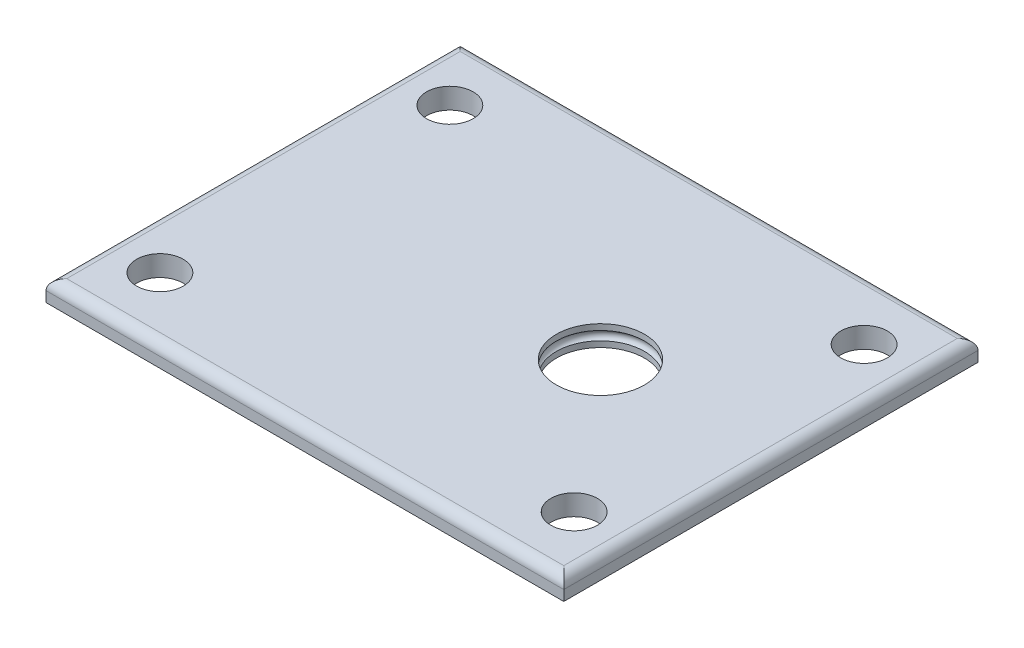
ISO-10303-21;
HEADER;
FILE_DESCRIPTION(('STEP AP214'),'2;1');
FILE_NAME('part.step','',(''),(''),'','','');
FILE_SCHEMA(('AUTOMOTIVE_DESIGN { 1 0 10303 214 1 1 1 1 }'));
ENDSEC;
DATA;
#1=APPLICATION_CONTEXT('core data for automotive mechanical design processes');
#2=APPLICATION_PROTOCOL_DEFINITION('international standard','automotive_design',2000,#1);
#3=PRODUCT_CONTEXT('',#1,'mechanical');
#4=PRODUCT('Part','Part','',(#3));
#5=PRODUCT_RELATED_PRODUCT_CATEGORY('part','',(#4));
#6=PRODUCT_DEFINITION_FORMATION('','',#4);
#7=PRODUCT_DEFINITION_CONTEXT('part definition',#1,'design');
#8=PRODUCT_DEFINITION('design','',#6,#7);
#9=PRODUCT_DEFINITION_SHAPE('','',#8);
#10=(LENGTH_UNIT() NAMED_UNIT(*) SI_UNIT(.MILLI.,.METRE.));
#11=(NAMED_UNIT(*) PLANE_ANGLE_UNIT() SI_UNIT($,.RADIAN.));
#12=(NAMED_UNIT(*) SI_UNIT($,.STERADIAN.) SOLID_ANGLE_UNIT());
#13=UNCERTAINTY_MEASURE_WITH_UNIT(LENGTH_MEASURE(1.E-05),#10,'distance_accuracy_value','');
#14=(GEOMETRIC_REPRESENTATION_CONTEXT(3) GLOBAL_UNCERTAINTY_ASSIGNED_CONTEXT((#13)) GLOBAL_UNIT_ASSIGNED_CONTEXT((#10,
#11,#12)) REPRESENTATION_CONTEXT('',''));
#15=CARTESIAN_POINT('',(0.,0.,0.));
#16=DIRECTION('',(0.,0.,1.));
#17=DIRECTION('',(1.,0.,0.));
#18=AXIS2_PLACEMENT_3D('',#15,#16,#17);
#19=CARTESIAN_POINT('',(28.54,-0.00100000000000013,14.));
#20=DIRECTION('',(0.,1.,0.));
#21=DIRECTION('',(0.,0.,1.));
#22=AXIS2_PLACEMENT_3D('',#19,#20,#21);
#23=CYLINDRICAL_SURFACE('',#22,4.25000000000001);
#24=CARTESIAN_POINT('',(28.54,2.,14.));
#25=DIRECTION('',(0.,1.,0.));
#26=DIRECTION('',(0.,0.,1.));
#27=AXIS2_PLACEMENT_3D('',#24,#25,#26);
#28=CIRCLE('',#27,4.25000000000001);
#29=CARTESIAN_POINT('',(28.54,2.,18.25));
#30=VERTEX_POINT('',#29);
#31=EDGE_CURVE('E149',#30,#30,#28,.T.);
#32=ORIENTED_EDGE('',*,*,#31,.T.);
#33=EDGE_LOOP('',(#32));
#34=FACE_BOUND('',#33,.T.);
#35=CARTESIAN_POINT('',(28.54,1.43301270189221,14.));
#36=DIRECTION('',(0.,-1.,0.));
#37=DIRECTION('',(0.,0.,-1.));
#38=AXIS2_PLACEMENT_3D('',#35,#36,#37);
#39=CIRCLE('',#38,4.25000000000001);
#40=CARTESIAN_POINT('',(28.54,1.43301270189221,9.74999999999999));
#41=VERTEX_POINT('',#40);
#42=EDGE_CURVE('E145',#41,#41,#39,.F.);
#43=ORIENTED_EDGE('',*,*,#42,.F.);
#44=EDGE_LOOP('',(#43));
#45=FACE_BOUND('',#44,.T.);
#46=ADVANCED_FACE('F38',(#34,#45),#23,.F.);
#47=CARTESIAN_POINT('',(28.54,0.,14.));
#48=DIRECTION('',(0.,1.,0.));
#49=DIRECTION('',(0.,0.,1.));
#50=AXIS2_PLACEMENT_3D('',#47,#48,#49);
#51=CIRCLE('',#50,4.25000000000001);
#52=CARTESIAN_POINT('',(28.54,0.,18.25));
#53=VERTEX_POINT('',#52);
#54=EDGE_CURVE('E246',#53,#53,#51,.F.);
#55=ORIENTED_EDGE('',*,*,#54,.T.);
#56=EDGE_LOOP('',(#55));
#57=FACE_BOUND('',#56,.T.);
#58=CARTESIAN_POINT('',(28.54,0.566987298107786,14.));
#59=DIRECTION('',(0.,1.,0.));
#60=DIRECTION('',(0.,0.,1.));
#61=AXIS2_PLACEMENT_3D('',#58,#59,#60);
#62=CIRCLE('',#61,4.25000000000001);
#63=CARTESIAN_POINT('',(28.54,0.566987298107786,18.25));
#64=VERTEX_POINT('',#63);
#65=EDGE_CURVE('E141',#64,#64,#62,.F.);
#66=ORIENTED_EDGE('',*,*,#65,.F.);
#67=EDGE_LOOP('',(#66));
#68=FACE_BOUND('',#67,.T.);
#69=ADVANCED_FACE('F206',(#57,#68),#23,.F.);
#70=CARTESIAN_POINT('',(0.,2.,0.));
#71=DIRECTION('',(0.,1.,0.));
#72=DIRECTION('',(0.,0.,1.));
#73=AXIS2_PLACEMENT_3D('',#70,#71,#72);
#74=PLANE('',#73);
#75=DIRECTION('',(-1.,0.,0.));
#76=VECTOR('',#75,1.);
#77=CARTESIAN_POINT('',(-5.,2.,-5.00000000000001));
#78=LINE('',#77,#76);
#79=CARTESIAN_POINT('',(44.,2.,-5.00000000000001));
#80=VERTEX_POINT('',#79);
#81=CARTESIAN_POINT('',(-4.,2.,-5.00000000000001));
#82=VERTEX_POINT('',#81);
#83=EDGE_CURVE('E155',#80,#82,#78,.T.);
#84=ORIENTED_EDGE('',*,*,#83,.T.);
#85=DIRECTION('',(0.,0.,1.));
#86=VECTOR('',#85,1.);
#87=CARTESIAN_POINT('',(-4.,2.,34.));
#88=LINE('',#87,#86);
#89=CARTESIAN_POINT('',(-4.,2.,33.));
#90=VERTEX_POINT('',#89);
#91=EDGE_CURVE('E158',#82,#90,#88,.T.);
#92=ORIENTED_EDGE('',*,*,#91,.T.);
#93=DIRECTION('',(1.,0.,0.));
#94=VECTOR('',#93,1.);
#95=CARTESIAN_POINT('',(45.,2.,33.));
#96=LINE('',#95,#94);
#97=CARTESIAN_POINT('',(44.,2.,33.));
#98=VERTEX_POINT('',#97);
#99=EDGE_CURVE('E104',#90,#98,#96,.T.);
#100=ORIENTED_EDGE('',*,*,#99,.T.);
#101=DIRECTION('',(0.,0.,-1.));
#102=VECTOR('',#101,1.);
#103=CARTESIAN_POINT('',(44.,2.,-6.00000000000001));
#104=LINE('',#103,#102);
#105=EDGE_CURVE('E152',#98,#80,#104,.T.);
#106=ORIENTED_EDGE('',*,*,#105,.T.);
#107=EDGE_LOOP('',(#84,#92,#100,#106));
#108=FACE_BOUND('',#107,.T.);
#109=ORIENTED_EDGE('',*,*,#31,.F.);
#110=EDGE_LOOP('',(#109));
#111=FACE_BOUND('',#110,.T.);
#112=CARTESIAN_POINT('',(0.,2.,28.));
#113=DIRECTION('',(0.,1.,0.));
#114=DIRECTION('',(0.,0.,1.));
#115=AXIS2_PLACEMENT_3D('',#112,#113,#114);
#116=CIRCLE('',#115,2.25000000000001);
#117=CARTESIAN_POINT('',(0.,2.,30.25));
#118=VERTEX_POINT('',#117);
#119=EDGE_CURVE('E261',#118,#118,#116,.T.);
#120=ORIENTED_EDGE('',*,*,#119,.F.);
#121=EDGE_LOOP('',(#120));
#122=FACE_BOUND('',#121,.T.);
#123=CARTESIAN_POINT('',(0.,2.,0.));
#124=DIRECTION('',(0.,1.,0.));
#125=DIRECTION('',(0.,0.,1.));
#126=AXIS2_PLACEMENT_3D('',#123,#124,#125);
#127=CIRCLE('',#126,2.25000000000001);
#128=CARTESIAN_POINT('',(0.,2.,2.25000000000001));
#129=VERTEX_POINT('',#128);
#130=EDGE_CURVE('E121',#129,#129,#127,.T.);
#131=ORIENTED_EDGE('',*,*,#130,.F.);
#132=EDGE_LOOP('',(#131));
#133=FACE_BOUND('',#132,.T.);
#134=CARTESIAN_POINT('',(40.,2.,0.));
#135=DIRECTION('',(0.,1.,0.));
#136=DIRECTION('',(0.,0.,1.));
#137=AXIS2_PLACEMENT_3D('',#134,#135,#136);
#138=CIRCLE('',#137,2.25000000000001);
#139=CARTESIAN_POINT('',(40.,2.,2.25000000000001));
#140=VERTEX_POINT('',#139);
#141=EDGE_CURVE('E269',#140,#140,#138,.T.);
#142=ORIENTED_EDGE('',*,*,#141,.F.);
#143=EDGE_LOOP('',(#142));
#144=FACE_BOUND('',#143,.T.);
#145=CARTESIAN_POINT('',(40.,2.,28.));
#146=DIRECTION('',(0.,1.,0.));
#147=DIRECTION('',(0.,0.,1.));
#148=AXIS2_PLACEMENT_3D('',#145,#146,#147);
#149=CIRCLE('',#148,2.25000000000001);
#150=CARTESIAN_POINT('',(40.,2.,30.25));
#151=VERTEX_POINT('',#150);
#152=EDGE_CURVE('E253',#151,#151,#149,.T.);
#153=ORIENTED_EDGE('',*,*,#152,.F.);
#154=EDGE_LOOP('',(#153));
#155=FACE_BOUND('',#154,.T.);
#156=ADVANCED_FACE('F213',(#108,#111,#122,#133,#144,#155),#74,.T.);
#157=CARTESIAN_POINT('',(0.,0.,0.));
#158=DIRECTION('',(0.,1.,0.));
#159=DIRECTION('',(0.,0.,1.));
#160=AXIS2_PLACEMENT_3D('',#157,#158,#159);
#161=PLANE('',#160);
#162=ORIENTED_EDGE('',*,*,#54,.F.);
#163=EDGE_LOOP('',(#162));
#164=FACE_BOUND('',#163,.T.);
#165=DIRECTION('',(0.,0.,1.));
#166=VECTOR('',#165,1.);
#167=CARTESIAN_POINT('',(-5.,0.,-6.00000000000001));
#168=LINE('',#167,#166);
#169=CARTESIAN_POINT('',(-5.,0.,-6.00000000000001));
#170=VERTEX_POINT('',#169);
#171=CARTESIAN_POINT('',(-5.,0.,34.));
#172=VERTEX_POINT('',#171);
#173=EDGE_CURVE('E112',#170,#172,#168,.T.);
#174=ORIENTED_EDGE('',*,*,#173,.F.);
#175=DIRECTION('',(-1.,0.,0.));
#176=VECTOR('',#175,1.);
#177=CARTESIAN_POINT('',(-5.,0.,-6.00000000000001));
#178=LINE('',#177,#176);
#179=CARTESIAN_POINT('',(45.,0.,-6.00000000000001));
#180=VERTEX_POINT('',#179);
#181=EDGE_CURVE('E131',#180,#170,#178,.T.);
#182=ORIENTED_EDGE('',*,*,#181,.F.);
#183=DIRECTION('',(0.,0.,-1.));
#184=VECTOR('',#183,1.);
#185=CARTESIAN_POINT('',(45.,0.,-6.00000000000001));
#186=LINE('',#185,#184);
#187=CARTESIAN_POINT('',(45.,0.,34.));
#188=VERTEX_POINT('',#187);
#189=EDGE_CURVE('E114',#188,#180,#186,.T.);
#190=ORIENTED_EDGE('',*,*,#189,.F.);
#191=DIRECTION('',(1.,0.,0.));
#192=VECTOR('',#191,1.);
#193=CARTESIAN_POINT('',(-5.,0.,34.));
#194=LINE('',#193,#192);
#195=EDGE_CURVE('E96',#172,#188,#194,.T.);
#196=ORIENTED_EDGE('',*,*,#195,.F.);
#197=EDGE_LOOP('',(#174,#182,#190,#196));
#198=FACE_BOUND('',#197,.T.);
#199=CARTESIAN_POINT('',(0.,0.,0.));
#200=DIRECTION('',(0.,1.,0.));
#201=DIRECTION('',(0.,0.,1.));
#202=AXIS2_PLACEMENT_3D('',#199,#200,#201);
#203=CIRCLE('',#202,2.25000000000001);
#204=CARTESIAN_POINT('',(0.,0.,2.25000000000001));
#205=VERTEX_POINT('',#204);
#206=EDGE_CURVE('E125',#205,#205,#203,.T.);
#207=ORIENTED_EDGE('',*,*,#206,.T.);
#208=EDGE_LOOP('',(#207));
#209=FACE_BOUND('',#208,.T.);
#210=CARTESIAN_POINT('',(40.,0.,0.));
#211=DIRECTION('',(0.,1.,0.));
#212=DIRECTION('',(0.,0.,1.));
#213=AXIS2_PLACEMENT_3D('',#210,#211,#212);
#214=CIRCLE('',#213,2.25000000000001);
#215=CARTESIAN_POINT('',(40.,0.,2.25000000000001));
#216=VERTEX_POINT('',#215);
#217=EDGE_CURVE('E265',#216,#216,#214,.T.);
#218=ORIENTED_EDGE('',*,*,#217,.T.);
#219=EDGE_LOOP('',(#218));
#220=FACE_BOUND('',#219,.T.);
#221=CARTESIAN_POINT('',(0.,0.,28.));
#222=DIRECTION('',(0.,1.,0.));
#223=DIRECTION('',(0.,0.,1.));
#224=AXIS2_PLACEMENT_3D('',#221,#222,#223);
#225=CIRCLE('',#224,2.25000000000001);
#226=CARTESIAN_POINT('',(0.,0.,30.25));
#227=VERTEX_POINT('',#226);
#228=EDGE_CURVE('E259',#227,#227,#225,.T.);
#229=ORIENTED_EDGE('',*,*,#228,.T.);
#230=EDGE_LOOP('',(#229));
#231=FACE_BOUND('',#230,.T.);
#232=CARTESIAN_POINT('',(40.,0.,28.));
#233=DIRECTION('',(0.,1.,0.));
#234=DIRECTION('',(0.,0.,1.));
#235=AXIS2_PLACEMENT_3D('',#232,#233,#234);
#236=CIRCLE('',#235,2.25000000000001);
#237=CARTESIAN_POINT('',(40.,0.,30.25));
#238=VERTEX_POINT('',#237);
#239=EDGE_CURVE('E248',#238,#238,#236,.T.);
#240=ORIENTED_EDGE('',*,*,#239,.T.);
#241=EDGE_LOOP('',(#240));
#242=FACE_BOUND('',#241,.T.);
#243=ADVANCED_FACE('F109',(#164,#198,#209,#220,#231,#242),#161,.F.);
#244=CARTESIAN_POINT('',(-5.,2.,-6.00000000000001));
#245=DIRECTION('',(1.,0.,0.));
#246=DIRECTION('',(0.,0.,-1.));
#247=AXIS2_PLACEMENT_3D('',#244,#245,#246);
#248=PLANE('',#247);
#249=DIRECTION('',(0.,-1.,0.));
#250=VECTOR('',#249,1.);
#251=CARTESIAN_POINT('',(-5.,2.,34.));
#252=LINE('',#251,#250);
#253=CARTESIAN_POINT('',(-5.,1.,34.));
#254=VERTEX_POINT('',#253);
#255=EDGE_CURVE('E93',#254,#172,#252,.T.);
#256=ORIENTED_EDGE('',*,*,#255,.F.);
#257=DIRECTION('',(0.,0.,1.));
#258=VECTOR('',#257,1.);
#259=CARTESIAN_POINT('',(-5.,1.,-6.00000000000001));
#260=LINE('',#259,#258);
#261=CARTESIAN_POINT('',(-5.,1.,-6.00000000000001));
#262=VERTEX_POINT('',#261);
#263=EDGE_CURVE('E162',#254,#262,#260,.F.);
#264=ORIENTED_EDGE('',*,*,#263,.T.);
#265=DIRECTION('',(0.,-1.,0.));
#266=VECTOR('',#265,1.);
#267=CARTESIAN_POINT('',(-5.,2.,-6.00000000000001));
#268=LINE('',#267,#266);
#269=EDGE_CURVE('E118',#262,#170,#268,.T.);
#270=ORIENTED_EDGE('',*,*,#269,.T.);
#271=ORIENTED_EDGE('',*,*,#173,.T.);
#272=EDGE_LOOP('',(#256,#264,#270,#271));
#273=FACE_BOUND('',#272,.T.);
#274=ADVANCED_FACE('F117',(#273),#248,.F.);
#275=CARTESIAN_POINT('',(-5.,2.,34.));
#276=DIRECTION('',(0.,0.,-1.));
#277=DIRECTION('',(-1.,0.,0.));
#278=AXIS2_PLACEMENT_3D('',#275,#276,#277);
#279=PLANE('',#278);
#280=DIRECTION('',(0.,-1.,0.));
#281=VECTOR('',#280,1.);
#282=CARTESIAN_POINT('',(45.,2.,34.));
#283=LINE('',#282,#281);
#284=CARTESIAN_POINT('',(45.,1.,34.));
#285=VERTEX_POINT('',#284);
#286=EDGE_CURVE('E105',#285,#188,#283,.T.);
#287=ORIENTED_EDGE('',*,*,#286,.F.);
#288=DIRECTION('',(1.,0.,0.));
#289=VECTOR('',#288,1.);
#290=CARTESIAN_POINT('',(-5.,1.,34.));
#291=LINE('',#290,#289);
#292=EDGE_CURVE('E11',#285,#254,#291,.F.);
#293=ORIENTED_EDGE('',*,*,#292,.T.);
#294=ORIENTED_EDGE('',*,*,#255,.T.);
#295=ORIENTED_EDGE('',*,*,#195,.T.);
#296=EDGE_LOOP('',(#287,#293,#294,#295));
#297=FACE_BOUND('',#296,.T.);
#298=ADVANCED_FACE('F95',(#297),#279,.F.);
#299=CARTESIAN_POINT('',(45.,2.,-6.00000000000001));
#300=DIRECTION('',(-1.,0.,0.));
#301=DIRECTION('',(0.,0.,1.));
#302=AXIS2_PLACEMENT_3D('',#299,#300,#301);
#303=PLANE('',#302);
#304=DIRECTION('',(0.,-1.,0.));
#305=VECTOR('',#304,1.);
#306=CARTESIAN_POINT('',(45.,2.,-6.00000000000001));
#307=LINE('',#306,#305);
#308=CARTESIAN_POINT('',(45.,1.,-6.00000000000001));
#309=VERTEX_POINT('',#308);
#310=EDGE_CURVE('E136',#309,#180,#307,.T.);
#311=ORIENTED_EDGE('',*,*,#310,.F.);
#312=DIRECTION('',(0.,0.,-1.));
#313=VECTOR('',#312,1.);
#314=CARTESIAN_POINT('',(45.,1.,34.));
#315=LINE('',#314,#313);
#316=EDGE_CURVE('E48',#309,#285,#315,.F.);
#317=ORIENTED_EDGE('',*,*,#316,.T.);
#318=ORIENTED_EDGE('',*,*,#286,.T.);
#319=ORIENTED_EDGE('',*,*,#189,.T.);
#320=EDGE_LOOP('',(#311,#317,#318,#319));
#321=FACE_BOUND('',#320,.T.);
#322=ADVANCED_FACE('F195',(#321),#303,.F.);
#323=CARTESIAN_POINT('',(-5.,2.,-6.00000000000001));
#324=DIRECTION('',(0.,0.,1.));
#325=DIRECTION('',(1.,0.,0.));
#326=AXIS2_PLACEMENT_3D('',#323,#324,#325);
#327=PLANE('',#326);
#328=ORIENTED_EDGE('',*,*,#269,.F.);
#329=DIRECTION('',(-1.,0.,0.));
#330=VECTOR('',#329,1.);
#331=CARTESIAN_POINT('',(45.,1.,-6.00000000000001));
#332=LINE('',#331,#330);
#333=EDGE_CURVE('E63',#262,#309,#332,.F.);
#334=ORIENTED_EDGE('',*,*,#333,.T.);
#335=ORIENTED_EDGE('',*,*,#310,.T.);
#336=ORIENTED_EDGE('',*,*,#181,.T.);
#337=EDGE_LOOP('',(#328,#334,#335,#336));
#338=FACE_BOUND('',#337,.T.);
#339=ADVANCED_FACE('F194',(#338),#327,.F.);
#340=CARTESIAN_POINT('',(0.,2.,0.));
#341=DIRECTION('',(0.,-1.,0.));
#342=DIRECTION('',(0.,0.,-1.));
#343=AXIS2_PLACEMENT_3D('',#340,#341,#342);
#344=CYLINDRICAL_SURFACE('',#343,2.25000000000001);
#345=ORIENTED_EDGE('',*,*,#130,.T.);
#346=EDGE_LOOP('',(#345));
#347=FACE_BOUND('',#346,.T.);
#348=ORIENTED_EDGE('',*,*,#206,.F.);
#349=EDGE_LOOP('',(#348));
#350=FACE_BOUND('',#349,.T.);
#351=ADVANCED_FACE('F202',(#347,#350),#344,.F.);
#352=CARTESIAN_POINT('',(40.,2.,0.));
#353=DIRECTION('',(0.,-1.,0.));
#354=DIRECTION('',(0.,0.,-1.));
#355=AXIS2_PLACEMENT_3D('',#352,#353,#354);
#356=CYLINDRICAL_SURFACE('',#355,2.25000000000001);
#357=ORIENTED_EDGE('',*,*,#141,.T.);
#358=EDGE_LOOP('',(#357));
#359=FACE_BOUND('',#358,.T.);
#360=ORIENTED_EDGE('',*,*,#217,.F.);
#361=EDGE_LOOP('',(#360));
#362=FACE_BOUND('',#361,.T.);
#363=ADVANCED_FACE('F227',(#359,#362),#356,.F.);
#364=CARTESIAN_POINT('',(0.,2.,28.));
#365=DIRECTION('',(0.,-1.,0.));
#366=DIRECTION('',(0.,0.,-1.));
#367=AXIS2_PLACEMENT_3D('',#364,#365,#366);
#368=CYLINDRICAL_SURFACE('',#367,2.25000000000001);
#369=ORIENTED_EDGE('',*,*,#119,.T.);
#370=EDGE_LOOP('',(#369));
#371=FACE_BOUND('',#370,.T.);
#372=ORIENTED_EDGE('',*,*,#228,.F.);
#373=EDGE_LOOP('',(#372));
#374=FACE_BOUND('',#373,.T.);
#375=ADVANCED_FACE('F223',(#371,#374),#368,.F.);
#376=CARTESIAN_POINT('',(40.,2.,28.));
#377=DIRECTION('',(0.,-1.,0.));
#378=DIRECTION('',(0.,0.,-1.));
#379=AXIS2_PLACEMENT_3D('',#376,#377,#378);
#380=CYLINDRICAL_SURFACE('',#379,2.25000000000001);
#381=ORIENTED_EDGE('',*,*,#152,.T.);
#382=EDGE_LOOP('',(#381));
#383=FACE_BOUND('',#382,.T.);
#384=ORIENTED_EDGE('',*,*,#239,.F.);
#385=EDGE_LOOP('',(#384));
#386=FACE_BOUND('',#385,.T.);
#387=ADVANCED_FACE('F220',(#383,#386),#380,.F.);
#388=CARTESIAN_POINT('',(28.54,1.,14.));
#389=DIRECTION('',(0.,1.,0.));
#390=DIRECTION('',(0.,0.,1.));
#391=AXIS2_PLACEMENT_3D('',#388,#389,#390);
#392=TOROIDAL_SURFACE('',#391,4.,0.5);
#393=ORIENTED_EDGE('',*,*,#65,.T.);
#394=EDGE_LOOP('',(#393));
#395=FACE_BOUND('',#394,.T.);
#396=ORIENTED_EDGE('',*,*,#42,.T.);
#397=EDGE_LOOP('',(#396));
#398=FACE_BOUND('',#397,.T.);
#399=ADVANCED_FACE('F219',(#395,#398),#392,.F.);
#400=CARTESIAN_POINT('',(44.,1.,0.));
#401=DIRECTION('',(0.,0.,1.));
#402=DIRECTION('',(1.,0.,0.));
#403=AXIS2_PLACEMENT_3D('',#400,#401,#402);
#404=CYLINDRICAL_SURFACE('',#403,1.);
#405=CARTESIAN_POINT('',(44.,1.,33.));
#406=DIRECTION('',(-0.707106781186547,0.,0.707106781186547));
#407=DIRECTION('',(-0.707106781186547,0.,-0.707106781186547));
#408=AXIS2_PLACEMENT_3D('',#405,#406,#407);
#409=ELLIPSE('',#408,1.41421356237309,1.);
#410=EDGE_CURVE('E174',#285,#98,#409,.T.);
#411=ORIENTED_EDGE('',*,*,#410,.F.);
#412=ORIENTED_EDGE('',*,*,#316,.F.);
#413=CARTESIAN_POINT('',(44.,1.,-5.00000000000001));
#414=DIRECTION('',(0.707106781186547,0.,0.707106781186547));
#415=DIRECTION('',(-0.707106781186547,0.,0.707106781186547));
#416=AXIS2_PLACEMENT_3D('',#413,#414,#415);
#417=ELLIPSE('',#416,1.41421356237309,1.);
#418=EDGE_CURVE('E42',#80,#309,#417,.F.);
#419=ORIENTED_EDGE('',*,*,#418,.F.);
#420=ORIENTED_EDGE('',*,*,#105,.F.);
#421=EDGE_LOOP('',(#411,#412,#419,#420));
#422=FACE_BOUND('',#421,.T.);
#423=ADVANCED_FACE('F40',(#422),#404,.T.);
#424=CARTESIAN_POINT('',(0.,1.,-5.00000000000001));
#425=DIRECTION('',(1.,0.,0.));
#426=DIRECTION('',(0.,0.,-1.));
#427=AXIS2_PLACEMENT_3D('',#424,#425,#426);
#428=CYLINDRICAL_SURFACE('',#427,1.);
#429=ORIENTED_EDGE('',*,*,#418,.T.);
#430=ORIENTED_EDGE('',*,*,#333,.F.);
#431=CARTESIAN_POINT('',(-4.,1.,-5.00000000000001));
#432=DIRECTION('',(0.707106781186547,0.,-0.707106781186547));
#433=DIRECTION('',(0.707106781186547,0.,0.707106781186547));
#434=AXIS2_PLACEMENT_3D('',#431,#432,#433);
#435=ELLIPSE('',#434,1.41421356237309,1.);
#436=EDGE_CURVE('E172',#82,#262,#435,.F.);
#437=ORIENTED_EDGE('',*,*,#436,.F.);
#438=ORIENTED_EDGE('',*,*,#83,.F.);
#439=EDGE_LOOP('',(#429,#430,#437,#438));
#440=FACE_BOUND('',#439,.T.);
#441=ADVANCED_FACE('F185',(#440),#428,.T.);
#442=CARTESIAN_POINT('',(0.,1.,33.));
#443=DIRECTION('',(-1.,0.,0.));
#444=DIRECTION('',(0.,0.,1.));
#445=AXIS2_PLACEMENT_3D('',#442,#443,#444);
#446=CYLINDRICAL_SURFACE('',#445,1.);
#447=ORIENTED_EDGE('',*,*,#410,.T.);
#448=ORIENTED_EDGE('',*,*,#99,.F.);
#449=CARTESIAN_POINT('',(-4.,1.,33.));
#450=DIRECTION('',(-0.707106781186547,0.,-0.707106781186547));
#451=DIRECTION('',(-0.707106781186547,0.,0.707106781186547));
#452=AXIS2_PLACEMENT_3D('',#449,#450,#451);
#453=ELLIPSE('',#452,1.41421356237309,1.);
#454=EDGE_CURVE('E169',#254,#90,#453,.T.);
#455=ORIENTED_EDGE('',*,*,#454,.F.);
#456=ORIENTED_EDGE('',*,*,#292,.F.);
#457=EDGE_LOOP('',(#447,#448,#455,#456));
#458=FACE_BOUND('',#457,.T.);
#459=ADVANCED_FACE('F190',(#458),#446,.T.);
#460=CARTESIAN_POINT('',(-4.,1.,0.));
#461=DIRECTION('',(0.,0.,-1.));
#462=DIRECTION('',(-1.,0.,0.));
#463=AXIS2_PLACEMENT_3D('',#460,#461,#462);
#464=CYLINDRICAL_SURFACE('',#463,1.);
#465=ORIENTED_EDGE('',*,*,#436,.T.);
#466=ORIENTED_EDGE('',*,*,#263,.F.);
#467=ORIENTED_EDGE('',*,*,#454,.T.);
#468=ORIENTED_EDGE('',*,*,#91,.F.);
#469=EDGE_LOOP('',(#465,#466,#467,#468));
#470=FACE_BOUND('',#469,.T.);
#471=ADVANCED_FACE('F193',(#470),#464,.T.);
#472=CLOSED_SHELL('',(#46,#69,#156,#243,#274,#298,#322,#339,#351,#363,#375,#387,#399,#423,#441,
#459,#471));
#473=MANIFOLD_SOLID_BREP('B2',#472);
#474=ADVANCED_BREP_SHAPE_REPRESENTATION('',(#18,#473),#14);
#475=SHAPE_DEFINITION_REPRESENTATION(#9,#474);
ENDSEC;
END-ISO-10303-21;
